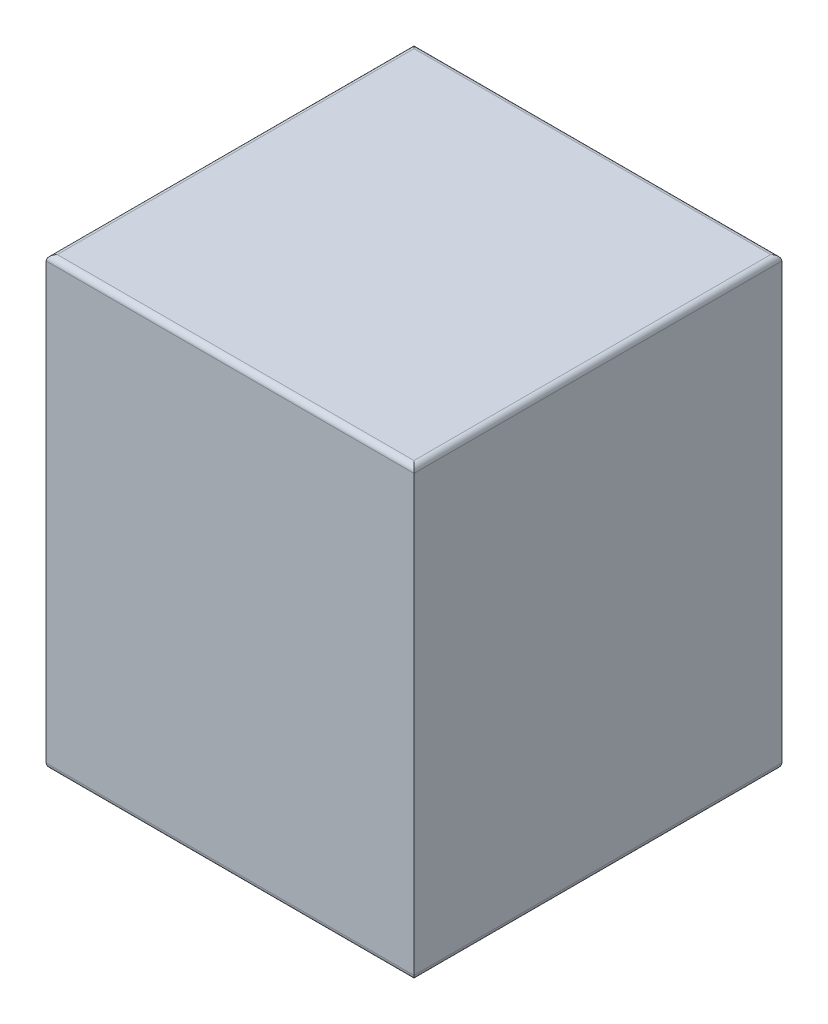
ISO-10303-21;
HEADER;
FILE_DESCRIPTION(('STEP AP214'),'2;1');
FILE_NAME('part.step','',(''),(''),'','','');
FILE_SCHEMA(('AUTOMOTIVE_DESIGN { 1 0 10303 214 1 1 1 1 }'));
ENDSEC;
DATA;
#1=APPLICATION_CONTEXT('core data for automotive mechanical design processes');
#2=APPLICATION_PROTOCOL_DEFINITION('international standard','automotive_design',2000,#1);
#3=PRODUCT_CONTEXT('',#1,'mechanical');
#4=PRODUCT('Part','Part','',(#3));
#5=PRODUCT_RELATED_PRODUCT_CATEGORY('part','',(#4));
#6=PRODUCT_DEFINITION_FORMATION('','',#4);
#7=PRODUCT_DEFINITION_CONTEXT('part definition',#1,'design');
#8=PRODUCT_DEFINITION('design','',#6,#7);
#9=PRODUCT_DEFINITION_SHAPE('','',#8);
#10=(LENGTH_UNIT() NAMED_UNIT(*) SI_UNIT(.MILLI.,.METRE.));
#11=(NAMED_UNIT(*) PLANE_ANGLE_UNIT() SI_UNIT($,.RADIAN.));
#12=(NAMED_UNIT(*) SI_UNIT($,.STERADIAN.) SOLID_ANGLE_UNIT());
#13=UNCERTAINTY_MEASURE_WITH_UNIT(LENGTH_MEASURE(1.E-05),#10,'distance_accuracy_value','');
#14=(GEOMETRIC_REPRESENTATION_CONTEXT(3) GLOBAL_UNCERTAINTY_ASSIGNED_CONTEXT((#13)) GLOBAL_UNIT_ASSIGNED_CONTEXT((#10,
#11,#12)) REPRESENTATION_CONTEXT('',''));
#15=CARTESIAN_POINT('',(0.,0.,0.));
#16=DIRECTION('',(0.,0.,1.));
#17=DIRECTION('',(1.,0.,0.));
#18=AXIS2_PLACEMENT_3D('',#15,#16,#17);
#19=CARTESIAN_POINT('',(-16.4999999108311,40.,16.4999997095889));
#20=DIRECTION('',(1.,0.,0.));
#21=DIRECTION('',(0.,0.,-1.));
#22=AXIS2_PLACEMENT_3D('',#19,#20,#21);
#23=PLANE('',#22);
#24=DIRECTION('',(0.,-1.,0.));
#25=VECTOR('',#24,1.);
#26=CARTESIAN_POINT('',(-16.499999910831,40.,-16.5000002904111));
#27=LINE('',#26,#25);
#28=CARTESIAN_POINT('',(-16.499999910831,39.5,-16.5000002904111));
#29=VERTEX_POINT('',#28);
#30=CARTESIAN_POINT('',(-16.499999910831,0.5,-16.5000002904111));
#31=VERTEX_POINT('',#30);
#32=EDGE_CURVE('E163',#29,#31,#27,.T.);
#33=ORIENTED_EDGE('',*,*,#32,.T.);
#34=DIRECTION('',(0.,0.,1.));
#35=VECTOR('',#34,1.);
#36=CARTESIAN_POINT('',(-16.4999999108311,0.5,16.4999997095889));
#37=LINE('',#36,#35);
#38=CARTESIAN_POINT('',(-16.4999999108311,0.5,16.4999997095889));
#39=VERTEX_POINT('',#38);
#40=EDGE_CURVE('E130',#31,#39,#37,.T.);
#41=ORIENTED_EDGE('',*,*,#40,.T.);
#42=DIRECTION('',(0.,-1.,0.));
#43=VECTOR('',#42,1.);
#44=CARTESIAN_POINT('',(-16.4999999108311,40.,16.4999997095889));
#45=LINE('',#44,#43);
#46=CARTESIAN_POINT('',(-16.4999999108311,39.5,16.4999997095889));
#47=VERTEX_POINT('',#46);
#48=EDGE_CURVE('E114',#47,#39,#45,.T.);
#49=ORIENTED_EDGE('',*,*,#48,.F.);
#50=DIRECTION('',(0.,0.,1.));
#51=VECTOR('',#50,1.);
#52=CARTESIAN_POINT('',(-16.4999999108311,39.5,16.4999997095889));
#53=LINE('',#52,#51);
#54=EDGE_CURVE('E127',#47,#29,#53,.F.);
#55=ORIENTED_EDGE('',*,*,#54,.T.);
#56=EDGE_LOOP('',(#33,#41,#49,#55));
#57=FACE_BOUND('',#56,.T.);
#58=ADVANCED_FACE('F43',(#57),#23,.F.);
#59=CARTESIAN_POINT('',(16.5000000891689,40.,16.4999997095889));
#60=DIRECTION('',(0.,0.,-1.));
#61=DIRECTION('',(-1.,0.,0.));
#62=AXIS2_PLACEMENT_3D('',#59,#60,#61);
#63=PLANE('',#62);
#64=ORIENTED_EDGE('',*,*,#48,.T.);
#65=DIRECTION('',(1.,0.,0.));
#66=VECTOR('',#65,1.);
#67=CARTESIAN_POINT('',(16.5000000891689,0.5,16.4999997095889));
#68=LINE('',#67,#66);
#69=CARTESIAN_POINT('',(16.5000000891689,0.5,16.4999997095889));
#70=VERTEX_POINT('',#69);
#71=EDGE_CURVE('E120',#39,#70,#68,.T.);
#72=ORIENTED_EDGE('',*,*,#71,.T.);
#73=DIRECTION('',(0.,-1.,0.));
#74=VECTOR('',#73,1.);
#75=CARTESIAN_POINT('',(16.5000000891689,40.,16.4999997095889));
#76=LINE('',#75,#74);
#77=CARTESIAN_POINT('',(16.5000000891689,39.5,16.4999997095889));
#78=VERTEX_POINT('',#77);
#79=EDGE_CURVE('E116',#78,#70,#76,.T.);
#80=ORIENTED_EDGE('',*,*,#79,.F.);
#81=DIRECTION('',(1.,0.,0.));
#82=VECTOR('',#81,1.);
#83=CARTESIAN_POINT('',(16.5000000891689,39.5,16.4999997095889));
#84=LINE('',#83,#82);
#85=EDGE_CURVE('E111',#78,#47,#84,.F.);
#86=ORIENTED_EDGE('',*,*,#85,.T.);
#87=EDGE_LOOP('',(#64,#72,#80,#86));
#88=FACE_BOUND('',#87,.T.);
#89=ADVANCED_FACE('F113',(#88),#63,.F.);
#90=CARTESIAN_POINT('',(16.500000089169,40.,-16.5000002904111));
#91=DIRECTION('',(-1.,0.,0.));
#92=DIRECTION('',(0.,0.,1.));
#93=AXIS2_PLACEMENT_3D('',#90,#91,#92);
#94=PLANE('',#93);
#95=ORIENTED_EDGE('',*,*,#79,.T.);
#96=DIRECTION('',(0.,0.,-1.));
#97=VECTOR('',#96,1.);
#98=CARTESIAN_POINT('',(16.500000089169,0.5,-16.5000002904111));
#99=LINE('',#98,#97);
#100=CARTESIAN_POINT('',(16.500000089169,0.5,-16.5000002904111));
#101=VERTEX_POINT('',#100);
#102=EDGE_CURVE('E187',#70,#101,#99,.T.);
#103=ORIENTED_EDGE('',*,*,#102,.T.);
#104=DIRECTION('',(0.,-1.,0.));
#105=VECTOR('',#104,1.);
#106=CARTESIAN_POINT('',(16.500000089169,40.,-16.5000002904111));
#107=LINE('',#106,#105);
#108=CARTESIAN_POINT('',(16.500000089169,39.5,-16.5000002904111));
#109=VERTEX_POINT('',#108);
#110=EDGE_CURVE('E168',#109,#101,#107,.T.);
#111=ORIENTED_EDGE('',*,*,#110,.F.);
#112=DIRECTION('',(0.,0.,-1.));
#113=VECTOR('',#112,1.);
#114=CARTESIAN_POINT('',(16.500000089169,39.5,-16.5000002904111));
#115=LINE('',#114,#113);
#116=EDGE_CURVE('E185',#109,#78,#115,.F.);
#117=ORIENTED_EDGE('',*,*,#116,.T.);
#118=EDGE_LOOP('',(#95,#103,#111,#117));
#119=FACE_BOUND('',#118,.T.);
#120=ADVANCED_FACE('F204',(#119),#94,.F.);
#121=CARTESIAN_POINT('',(-16.499999910831,40.,-16.5000002904111));
#122=DIRECTION('',(0.,0.,1.));
#123=DIRECTION('',(1.,0.,0.));
#124=AXIS2_PLACEMENT_3D('',#121,#122,#123);
#125=PLANE('',#124);
#126=ORIENTED_EDGE('',*,*,#110,.T.);
#127=DIRECTION('',(-1.,0.,0.));
#128=VECTOR('',#127,1.);
#129=CARTESIAN_POINT('',(-16.499999910831,0.5,-16.5000002904111));
#130=LINE('',#129,#128);
#131=EDGE_CURVE('E191',#101,#31,#130,.T.);
#132=ORIENTED_EDGE('',*,*,#131,.T.);
#133=ORIENTED_EDGE('',*,*,#32,.F.);
#134=DIRECTION('',(-1.,0.,0.));
#135=VECTOR('',#134,1.);
#136=CARTESIAN_POINT('',(-16.499999910831,39.5,-16.5000002904111));
#137=LINE('',#136,#135);
#138=EDGE_CURVE('E189',#29,#109,#137,.F.);
#139=ORIENTED_EDGE('',*,*,#138,.T.);
#140=EDGE_LOOP('',(#126,#132,#133,#139));
#141=FACE_BOUND('',#140,.T.);
#142=ADVANCED_FACE('F202',(#141),#125,.F.);
#143=CARTESIAN_POINT('',(0.,40.,0.));
#144=DIRECTION('',(0.,-1.,0.));
#145=DIRECTION('',(0.,0.,-1.));
#146=AXIS2_PLACEMENT_3D('',#143,#144,#145);
#147=PLANE('',#146);
#148=DIRECTION('',(-1.,0.,0.));
#149=VECTOR('',#148,1.);
#150=CARTESIAN_POINT('',(0.,40.,-16.0000002904111));
#151=LINE('',#150,#149);
#152=CARTESIAN_POINT('',(16.000000089169,40.,-16.0000002904111));
#153=VERTEX_POINT('',#152);
#154=CARTESIAN_POINT('',(-15.999999910831,40.,-16.0000002904111));
#155=VERTEX_POINT('',#154);
#156=EDGE_CURVE('E193',#153,#155,#151,.T.);
#157=ORIENTED_EDGE('',*,*,#156,.T.);
#158=DIRECTION('',(0.,0.,1.));
#159=VECTOR('',#158,1.);
#160=CARTESIAN_POINT('',(-15.9999999108311,40.,0.));
#161=LINE('',#160,#159);
#162=CARTESIAN_POINT('',(-15.9999999108311,40.,15.9999997095889));
#163=VERTEX_POINT('',#162);
#164=EDGE_CURVE('E11',#155,#163,#161,.T.);
#165=ORIENTED_EDGE('',*,*,#164,.T.);
#166=DIRECTION('',(1.,0.,0.));
#167=VECTOR('',#166,1.);
#168=CARTESIAN_POINT('',(0.,40.,15.9999997095889));
#169=LINE('',#168,#167);
#170=CARTESIAN_POINT('',(16.0000000891689,40.,15.9999997095889));
#171=VERTEX_POINT('',#170);
#172=EDGE_CURVE('E52',#163,#171,#169,.T.);
#173=ORIENTED_EDGE('',*,*,#172,.T.);
#174=DIRECTION('',(0.,0.,-1.));
#175=VECTOR('',#174,1.);
#176=CARTESIAN_POINT('',(16.0000000891689,40.,0.));
#177=LINE('',#176,#175);
#178=EDGE_CURVE('E195',#171,#153,#177,.T.);
#179=ORIENTED_EDGE('',*,*,#178,.T.);
#180=EDGE_LOOP('',(#157,#165,#173,#179));
#181=FACE_BOUND('',#180,.T.);
#182=ADVANCED_FACE('F196',(#181),#147,.F.);
#183=CARTESIAN_POINT('',(0.,0.,0.));
#184=DIRECTION('',(0.,-1.,0.));
#185=DIRECTION('',(0.,0.,-1.));
#186=AXIS2_PLACEMENT_3D('',#183,#184,#185);
#187=PLANE('',#186);
#188=DIRECTION('',(1.,0.,0.));
#189=VECTOR('',#188,1.);
#190=CARTESIAN_POINT('',(-16.4999999108311,0.,15.9999997095889));
#191=LINE('',#190,#189);
#192=CARTESIAN_POINT('',(16.0000000891689,0.,15.9999997095889));
#193=VERTEX_POINT('',#192);
#194=CARTESIAN_POINT('',(-15.9999999108311,0.,15.9999997095889));
#195=VERTEX_POINT('',#194);
#196=EDGE_CURVE('E180',#193,#195,#191,.F.);
#197=ORIENTED_EDGE('',*,*,#196,.T.);
#198=DIRECTION('',(0.,0.,1.));
#199=VECTOR('',#198,1.);
#200=CARTESIAN_POINT('',(-15.999999910831,0.,-16.5000002904111));
#201=LINE('',#200,#199);
#202=CARTESIAN_POINT('',(-15.999999910831,0.,-16.0000002904111));
#203=VERTEX_POINT('',#202);
#204=EDGE_CURVE('E121',#195,#203,#201,.F.);
#205=ORIENTED_EDGE('',*,*,#204,.T.);
#206=DIRECTION('',(-1.,0.,0.));
#207=VECTOR('',#206,1.);
#208=CARTESIAN_POINT('',(16.500000089169,0.,-16.0000002904111));
#209=LINE('',#208,#207);
#210=CARTESIAN_POINT('',(16.000000089169,0.,-16.0000002904111));
#211=VERTEX_POINT('',#210);
#212=EDGE_CURVE('E176',#203,#211,#209,.F.);
#213=ORIENTED_EDGE('',*,*,#212,.T.);
#214=DIRECTION('',(0.,0.,-1.));
#215=VECTOR('',#214,1.);
#216=CARTESIAN_POINT('',(16.0000000891689,0.,16.4999997095889));
#217=LINE('',#216,#215);
#218=EDGE_CURVE('E178',#211,#193,#217,.F.);
#219=ORIENTED_EDGE('',*,*,#218,.T.);
#220=EDGE_LOOP('',(#197,#205,#213,#219));
#221=FACE_BOUND('',#220,.T.);
#222=ADVANCED_FACE('F230',(#221),#187,.T.);
#223=CARTESIAN_POINT('',(16.000000089169,0.5,-16.5000002904111));
#224=DIRECTION('',(0.,0.,1.));
#225=DIRECTION('',(1.,0.,0.));
#226=AXIS2_PLACEMENT_3D('',#223,#224,#225);
#227=CYLINDRICAL_SURFACE('',#226,0.5);
#228=CARTESIAN_POINT('',(16.0000000891689,0.5,15.9999997095889));
#229=DIRECTION('',(-0.707106781186548,0.,0.707106781186547));
#230=DIRECTION('',(0.707106781186547,0.,0.707106781186548));
#231=AXIS2_PLACEMENT_3D('',#228,#229,#230);
#232=ELLIPSE('',#231,0.707106781186547,0.5);
#233=EDGE_CURVE('E155',#193,#70,#232,.T.);
#234=ORIENTED_EDGE('',*,*,#233,.F.);
#235=ORIENTED_EDGE('',*,*,#218,.F.);
#236=CARTESIAN_POINT('',(16.000000089169,0.5,-16.0000002904111));
#237=DIRECTION('',(0.707106781186547,0.,0.707106781186548));
#238=DIRECTION('',(0.707106781186548,0.,-0.707106781186547));
#239=AXIS2_PLACEMENT_3D('',#236,#237,#238);
#240=ELLIPSE('',#239,0.707106781186548,0.5);
#241=EDGE_CURVE('E142',#101,#211,#240,.F.);
#242=ORIENTED_EDGE('',*,*,#241,.F.);
#243=ORIENTED_EDGE('',*,*,#102,.F.);
#244=EDGE_LOOP('',(#234,#235,#242,#243));
#245=FACE_BOUND('',#244,.T.);
#246=ADVANCED_FACE('F207',(#245),#227,.T.);
#247=CARTESIAN_POINT('',(-16.499999910831,0.5,-16.0000002904111));
#248=DIRECTION('',(1.,0.,0.));
#249=DIRECTION('',(0.,0.,-1.));
#250=AXIS2_PLACEMENT_3D('',#247,#248,#249);
#251=CYLINDRICAL_SURFACE('',#250,0.5);
#252=ORIENTED_EDGE('',*,*,#241,.T.);
#253=ORIENTED_EDGE('',*,*,#212,.F.);
#254=CARTESIAN_POINT('',(-15.999999910831,0.5,-16.0000002904111));
#255=DIRECTION('',(0.707106781186548,0.,-0.707106781186547));
#256=DIRECTION('',(0.707106781186547,0.,0.707106781186548));
#257=AXIS2_PLACEMENT_3D('',#254,#255,#256);
#258=ELLIPSE('',#257,0.707106781186548,0.5);
#259=EDGE_CURVE('E149',#31,#203,#258,.F.);
#260=ORIENTED_EDGE('',*,*,#259,.F.);
#261=ORIENTED_EDGE('',*,*,#131,.F.);
#262=EDGE_LOOP('',(#252,#253,#260,#261));
#263=FACE_BOUND('',#262,.T.);
#264=ADVANCED_FACE('F209',(#263),#251,.T.);
#265=CARTESIAN_POINT('',(16.5000000891689,0.5,15.9999997095889));
#266=DIRECTION('',(-1.,0.,0.));
#267=DIRECTION('',(0.,0.,1.));
#268=AXIS2_PLACEMENT_3D('',#265,#266,#267);
#269=CYLINDRICAL_SURFACE('',#268,0.5);
#270=ORIENTED_EDGE('',*,*,#233,.T.);
#271=ORIENTED_EDGE('',*,*,#71,.F.);
#272=CARTESIAN_POINT('',(-15.9999999108311,0.5,15.9999997095889));
#273=DIRECTION('',(-0.707106781186547,0.,-0.707106781186548));
#274=DIRECTION('',(-0.707106781186548,0.,0.707106781186547));
#275=AXIS2_PLACEMENT_3D('',#272,#273,#274);
#276=ELLIPSE('',#275,0.707106781186547,0.5);
#277=EDGE_CURVE('E145',#195,#39,#276,.T.);
#278=ORIENTED_EDGE('',*,*,#277,.F.);
#279=ORIENTED_EDGE('',*,*,#196,.F.);
#280=EDGE_LOOP('',(#270,#271,#278,#279));
#281=FACE_BOUND('',#280,.T.);
#282=ADVANCED_FACE('F212',(#281),#269,.T.);
#283=CARTESIAN_POINT('',(-15.9999999108311,0.5,16.4999997095889));
#284=DIRECTION('',(0.,0.,-1.));
#285=DIRECTION('',(-1.,0.,0.));
#286=AXIS2_PLACEMENT_3D('',#283,#284,#285);
#287=CYLINDRICAL_SURFACE('',#286,0.5);
#288=ORIENTED_EDGE('',*,*,#259,.T.);
#289=ORIENTED_EDGE('',*,*,#204,.F.);
#290=ORIENTED_EDGE('',*,*,#277,.T.);
#291=ORIENTED_EDGE('',*,*,#40,.F.);
#292=EDGE_LOOP('',(#288,#289,#290,#291));
#293=FACE_BOUND('',#292,.T.);
#294=ADVANCED_FACE('F210',(#293),#287,.T.);
#295=CARTESIAN_POINT('',(16.0000000891689,39.5,0.));
#296=DIRECTION('',(0.,0.,-1.));
#297=DIRECTION('',(-1.,0.,0.));
#298=AXIS2_PLACEMENT_3D('',#295,#296,#297);
#299=CYLINDRICAL_SURFACE('',#298,0.5);
#300=CARTESIAN_POINT('',(16.0000000891689,39.5,15.9999997095889));
#301=DIRECTION('',(0.707106781186548,0.,-0.707106781186547));
#302=DIRECTION('',(-0.707106781186547,0.,-0.707106781186548));
#303=AXIS2_PLACEMENT_3D('',#300,#301,#302);
#304=ELLIPSE('',#303,0.707106781186547,0.5);
#305=EDGE_CURVE('E139',#78,#171,#304,.F.);
#306=ORIENTED_EDGE('',*,*,#305,.F.);
#307=ORIENTED_EDGE('',*,*,#116,.F.);
#308=CARTESIAN_POINT('',(16.000000089169,39.5,-16.0000002904111));
#309=DIRECTION('',(-0.707106781186547,0.,-0.707106781186548));
#310=DIRECTION('',(-0.707106781186548,0.,0.707106781186547));
#311=AXIS2_PLACEMENT_3D('',#308,#309,#310);
#312=ELLIPSE('',#311,0.707106781186548,0.5);
#313=EDGE_CURVE('E47',#153,#109,#312,.T.);
#314=ORIENTED_EDGE('',*,*,#313,.F.);
#315=ORIENTED_EDGE('',*,*,#178,.F.);
#316=EDGE_LOOP('',(#306,#307,#314,#315));
#317=FACE_BOUND('',#316,.T.);
#318=ADVANCED_FACE('F45',(#317),#299,.T.);
#319=CARTESIAN_POINT('',(0.,39.5,-16.0000002904111));
#320=DIRECTION('',(-1.,0.,0.));
#321=DIRECTION('',(0.,0.,1.));
#322=AXIS2_PLACEMENT_3D('',#319,#320,#321);
#323=CYLINDRICAL_SURFACE('',#322,0.5);
#324=ORIENTED_EDGE('',*,*,#313,.T.);
#325=ORIENTED_EDGE('',*,*,#138,.F.);
#326=CARTESIAN_POINT('',(-15.9999999108311,39.5,-16.0000002904111));
#327=DIRECTION('',(-0.707106781186548,0.,0.707106781186547));
#328=DIRECTION('',(-0.707106781186547,0.,-0.707106781186548));
#329=AXIS2_PLACEMENT_3D('',#326,#327,#328);
#330=ELLIPSE('',#329,0.707106781186548,0.5);
#331=EDGE_CURVE('E134',#155,#29,#330,.T.);
#332=ORIENTED_EDGE('',*,*,#331,.F.);
#333=ORIENTED_EDGE('',*,*,#156,.F.);
#334=EDGE_LOOP('',(#324,#325,#332,#333));
#335=FACE_BOUND('',#334,.T.);
#336=ADVANCED_FACE('F199',(#335),#323,.T.);
#337=CARTESIAN_POINT('',(0.,39.5,15.9999997095889));
#338=DIRECTION('',(1.,0.,0.));
#339=DIRECTION('',(0.,0.,-1.));
#340=AXIS2_PLACEMENT_3D('',#337,#338,#339);
#341=CYLINDRICAL_SURFACE('',#340,0.5);
#342=ORIENTED_EDGE('',*,*,#305,.T.);
#343=ORIENTED_EDGE('',*,*,#172,.F.);
#344=CARTESIAN_POINT('',(-15.9999999108311,39.5,15.9999997095889));
#345=DIRECTION('',(0.707106781186547,0.,0.707106781186548));
#346=DIRECTION('',(0.707106781186548,0.,-0.707106781186547));
#347=AXIS2_PLACEMENT_3D('',#344,#345,#346);
#348=ELLIPSE('',#347,0.707106781186547,0.5);
#349=EDGE_CURVE('E60',#47,#163,#348,.F.);
#350=ORIENTED_EDGE('',*,*,#349,.F.);
#351=ORIENTED_EDGE('',*,*,#85,.F.);
#352=EDGE_LOOP('',(#342,#343,#350,#351));
#353=FACE_BOUND('',#352,.T.);
#354=ADVANCED_FACE('F137',(#353),#341,.T.);
#355=CARTESIAN_POINT('',(-15.9999999108311,39.5,0.));
#356=DIRECTION('',(0.,0.,1.));
#357=DIRECTION('',(1.,0.,0.));
#358=AXIS2_PLACEMENT_3D('',#355,#356,#357);
#359=CYLINDRICAL_SURFACE('',#358,0.5);
#360=ORIENTED_EDGE('',*,*,#331,.T.);
#361=ORIENTED_EDGE('',*,*,#54,.F.);
#362=ORIENTED_EDGE('',*,*,#349,.T.);
#363=ORIENTED_EDGE('',*,*,#164,.F.);
#364=EDGE_LOOP('',(#360,#361,#362,#363));
#365=FACE_BOUND('',#364,.T.);
#366=ADVANCED_FACE('F132',(#365),#359,.T.);
#367=CLOSED_SHELL('',(#58,#89,#120,#142,#182,#222,#246,#264,#282,#294,#318,#336,#354,#366));
#368=MANIFOLD_SOLID_BREP('B2',#367);
#369=ADVANCED_BREP_SHAPE_REPRESENTATION('',(#18,#368),#14);
#370=SHAPE_DEFINITION_REPRESENTATION(#9,#369);
ENDSEC;
END-ISO-10303-21;
